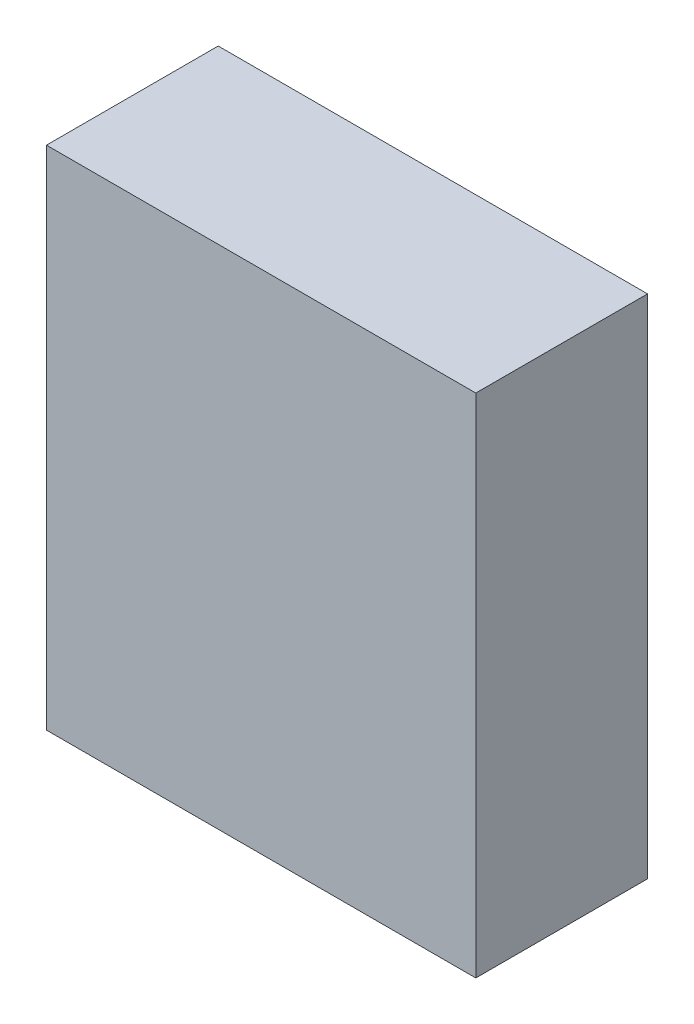
ISO-10303-21;
HEADER;
FILE_DESCRIPTION(('STEP AP214'),'2;1');
FILE_NAME('part.step','',(''),(''),'','','');
FILE_SCHEMA(('AUTOMOTIVE_DESIGN { 1 0 10303 214 1 1 1 1 }'));
ENDSEC;
DATA;
#1=APPLICATION_CONTEXT('core data for automotive mechanical design processes');
#2=APPLICATION_PROTOCOL_DEFINITION('international standard','automotive_design',2000,#1);
#3=PRODUCT_CONTEXT('',#1,'mechanical');
#4=PRODUCT('Part','Part','',(#3));
#5=PRODUCT_RELATED_PRODUCT_CATEGORY('part','',(#4));
#6=PRODUCT_DEFINITION_FORMATION('','',#4);
#7=PRODUCT_DEFINITION_CONTEXT('part definition',#1,'design');
#8=PRODUCT_DEFINITION('design','',#6,#7);
#9=PRODUCT_DEFINITION_SHAPE('','',#8);
#10=(LENGTH_UNIT() NAMED_UNIT(*) SI_UNIT(.MILLI.,.METRE.));
#11=(NAMED_UNIT(*) PLANE_ANGLE_UNIT() SI_UNIT($,.RADIAN.));
#12=(NAMED_UNIT(*) SI_UNIT($,.STERADIAN.) SOLID_ANGLE_UNIT());
#13=UNCERTAINTY_MEASURE_WITH_UNIT(LENGTH_MEASURE(1.E-05),#10,'distance_accuracy_value','');
#14=(GEOMETRIC_REPRESENTATION_CONTEXT(3) GLOBAL_UNCERTAINTY_ASSIGNED_CONTEXT((#13)) GLOBAL_UNIT_ASSIGNED_CONTEXT((#10,
#11,#12)) REPRESENTATION_CONTEXT('',''));
#15=CARTESIAN_POINT('',(0.,0.,0.));
#16=DIRECTION('',(0.,0.,1.));
#17=DIRECTION('',(1.,0.,0.));
#18=AXIS2_PLACEMENT_3D('',#15,#16,#17);
#19=CARTESIAN_POINT('',(50.,-59.,40.));
#20=DIRECTION('',(-1.,0.,0.));
#21=DIRECTION('',(0.,0.,1.));
#22=AXIS2_PLACEMENT_3D('',#19,#20,#21);
#23=PLANE('',#22);
#24=DIRECTION('',(0.,1.,0.));
#25=VECTOR('',#24,1.);
#26=CARTESIAN_POINT('',(50.,-59.,0.));
#27=LINE('',#26,#25);
#28=CARTESIAN_POINT('',(50.,-59.,0.));
#29=VERTEX_POINT('',#28);
#30=CARTESIAN_POINT('',(50.,59.,0.));
#31=VERTEX_POINT('',#30);
#32=EDGE_CURVE('E95',#29,#31,#27,.T.);
#33=ORIENTED_EDGE('',*,*,#32,.T.);
#34=DIRECTION('',(0.,0.,-1.));
#35=VECTOR('',#34,1.);
#36=CARTESIAN_POINT('',(50.,59.,40.));
#37=LINE('',#36,#35);
#38=CARTESIAN_POINT('',(50.,59.,40.));
#39=VERTEX_POINT('',#38);
#40=EDGE_CURVE('E11',#39,#31,#37,.T.);
#41=ORIENTED_EDGE('',*,*,#40,.F.);
#42=DIRECTION('',(0.,1.,0.));
#43=VECTOR('',#42,1.);
#44=CARTESIAN_POINT('',(50.,-59.,40.));
#45=LINE('',#44,#43);
#46=CARTESIAN_POINT('',(50.,-59.,40.));
#47=VERTEX_POINT('',#46);
#48=EDGE_CURVE('E83',#47,#39,#45,.T.);
#49=ORIENTED_EDGE('',*,*,#48,.F.);
#50=DIRECTION('',(0.,0.,-1.));
#51=VECTOR('',#50,1.);
#52=CARTESIAN_POINT('',(50.,-59.,40.));
#53=LINE('',#52,#51);
#54=EDGE_CURVE('E91',#47,#29,#53,.T.);
#55=ORIENTED_EDGE('',*,*,#54,.T.);
#56=EDGE_LOOP('',(#33,#41,#49,#55));
#57=FACE_BOUND('',#56,.T.);
#58=ADVANCED_FACE('F32',(#57),#23,.F.);
#59=CARTESIAN_POINT('',(-50.,59.,40.));
#60=DIRECTION('',(0.,-1.,0.));
#61=DIRECTION('',(0.,0.,-1.));
#62=AXIS2_PLACEMENT_3D('',#59,#60,#61);
#63=PLANE('',#62);
#64=DIRECTION('',(-1.,0.,0.));
#65=VECTOR('',#64,1.);
#66=CARTESIAN_POINT('',(-50.,59.,0.));
#67=LINE('',#66,#65);
#68=CARTESIAN_POINT('',(-50.,59.,0.));
#69=VERTEX_POINT('',#68);
#70=EDGE_CURVE('E87',#31,#69,#67,.T.);
#71=ORIENTED_EDGE('',*,*,#70,.T.);
#72=DIRECTION('',(0.,0.,-1.));
#73=VECTOR('',#72,1.);
#74=CARTESIAN_POINT('',(-50.,59.,40.));
#75=LINE('',#74,#73);
#76=CARTESIAN_POINT('',(-50.,59.,40.));
#77=VERTEX_POINT('',#76);
#78=EDGE_CURVE('E40',#77,#69,#75,.T.);
#79=ORIENTED_EDGE('',*,*,#78,.F.);
#80=DIRECTION('',(-1.,0.,0.));
#81=VECTOR('',#80,1.);
#82=CARTESIAN_POINT('',(-50.,59.,40.));
#83=LINE('',#82,#81);
#84=EDGE_CURVE('E78',#39,#77,#83,.T.);
#85=ORIENTED_EDGE('',*,*,#84,.F.);
#86=ORIENTED_EDGE('',*,*,#40,.T.);
#87=EDGE_LOOP('',(#71,#79,#85,#86));
#88=FACE_BOUND('',#87,.T.);
#89=ADVANCED_FACE('F86',(#88),#63,.F.);
#90=CARTESIAN_POINT('',(-50.,-59.,40.));
#91=DIRECTION('',(1.,0.,0.));
#92=DIRECTION('',(0.,0.,-1.));
#93=AXIS2_PLACEMENT_3D('',#90,#91,#92);
#94=PLANE('',#93);
#95=DIRECTION('',(0.,-1.,0.));
#96=VECTOR('',#95,1.);
#97=CARTESIAN_POINT('',(-50.,-59.,0.));
#98=LINE('',#97,#96);
#99=CARTESIAN_POINT('',(-50.,-59.,0.));
#100=VERTEX_POINT('',#99);
#101=EDGE_CURVE('E65',#69,#100,#98,.T.);
#102=ORIENTED_EDGE('',*,*,#101,.T.);
#103=DIRECTION('',(0.,0.,-1.));
#104=VECTOR('',#103,1.);
#105=CARTESIAN_POINT('',(-50.,-59.,40.));
#106=LINE('',#105,#104);
#107=CARTESIAN_POINT('',(-50.,-59.,40.));
#108=VERTEX_POINT('',#107);
#109=EDGE_CURVE('E88',#108,#100,#106,.T.);
#110=ORIENTED_EDGE('',*,*,#109,.F.);
#111=DIRECTION('',(0.,-1.,0.));
#112=VECTOR('',#111,1.);
#113=CARTESIAN_POINT('',(-50.,-59.,40.));
#114=LINE('',#113,#112);
#115=EDGE_CURVE('E81',#77,#108,#114,.T.);
#116=ORIENTED_EDGE('',*,*,#115,.F.);
#117=ORIENTED_EDGE('',*,*,#78,.T.);
#118=EDGE_LOOP('',(#102,#110,#116,#117));
#119=FACE_BOUND('',#118,.T.);
#120=ADVANCED_FACE('F89',(#119),#94,.F.);
#121=CARTESIAN_POINT('',(-50.,-59.,40.));
#122=DIRECTION('',(0.,1.,0.));
#123=DIRECTION('',(0.,0.,1.));
#124=AXIS2_PLACEMENT_3D('',#121,#122,#123);
#125=PLANE('',#124);
#126=DIRECTION('',(1.,0.,0.));
#127=VECTOR('',#126,1.);
#128=CARTESIAN_POINT('',(-50.,-59.,0.));
#129=LINE('',#128,#127);
#130=EDGE_CURVE('E71',#100,#29,#129,.T.);
#131=ORIENTED_EDGE('',*,*,#130,.T.);
#132=ORIENTED_EDGE('',*,*,#54,.F.);
#133=DIRECTION('',(1.,0.,0.));
#134=VECTOR('',#133,1.);
#135=CARTESIAN_POINT('',(-50.,-59.,40.));
#136=LINE('',#135,#134);
#137=EDGE_CURVE('E48',#108,#47,#136,.T.);
#138=ORIENTED_EDGE('',*,*,#137,.F.);
#139=ORIENTED_EDGE('',*,*,#109,.T.);
#140=EDGE_LOOP('',(#131,#132,#138,#139));
#141=FACE_BOUND('',#140,.T.);
#142=ADVANCED_FACE('F102',(#141),#125,.F.);
#143=CARTESIAN_POINT('',(50.,59.,40.));
#144=DIRECTION('',(0.,0.,-1.));
#145=DIRECTION('',(-1.,0.,0.));
#146=AXIS2_PLACEMENT_3D('',#143,#144,#145);
#147=PLANE('',#146);
#148=ORIENTED_EDGE('',*,*,#48,.T.);
#149=ORIENTED_EDGE('',*,*,#84,.T.);
#150=ORIENTED_EDGE('',*,*,#115,.T.);
#151=ORIENTED_EDGE('',*,*,#137,.T.);
#152=EDGE_LOOP('',(#148,#149,#150,#151));
#153=FACE_BOUND('',#152,.T.);
#154=ADVANCED_FACE('F79',(#153),#147,.F.);
#155=CARTESIAN_POINT('',(50.,59.,0.));
#156=DIRECTION('',(0.,0.,-1.));
#157=DIRECTION('',(-1.,0.,0.));
#158=AXIS2_PLACEMENT_3D('',#155,#156,#157);
#159=PLANE('',#158);
#160=ORIENTED_EDGE('',*,*,#32,.F.);
#161=ORIENTED_EDGE('',*,*,#130,.F.);
#162=ORIENTED_EDGE('',*,*,#101,.F.);
#163=ORIENTED_EDGE('',*,*,#70,.F.);
#164=EDGE_LOOP('',(#160,#161,#162,#163));
#165=FACE_BOUND('',#164,.T.);
#166=ADVANCED_FACE('F105',(#165),#159,.T.);
#167=CLOSED_SHELL('',(#58,#89,#120,#142,#154,#166));
#168=MANIFOLD_SOLID_BREP('B2',#167);
#169=ADVANCED_BREP_SHAPE_REPRESENTATION('',(#18,#168),#14);
#170=SHAPE_DEFINITION_REPRESENTATION(#9,#169);
ENDSEC;
END-ISO-10303-21;
